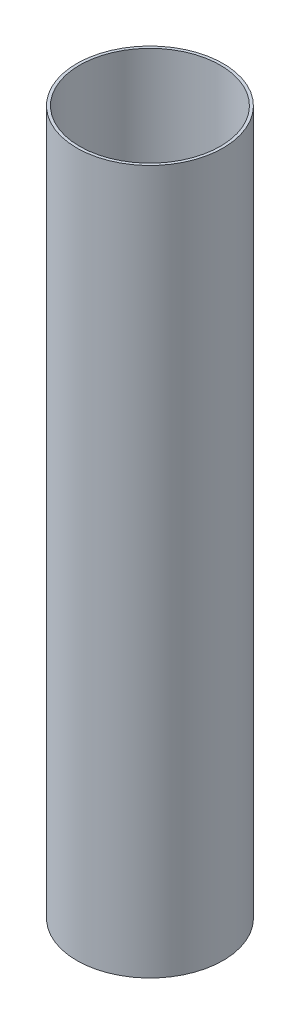
ISO-10303-21;
HEADER;
FILE_DESCRIPTION(('STEP AP214'),'2;1');
FILE_NAME('part.step','',(''),(''),'','','');
FILE_SCHEMA(('AUTOMOTIVE_DESIGN { 1 0 10303 214 1 1 1 1 }'));
ENDSEC;
DATA;
#1=APPLICATION_CONTEXT('core data for automotive mechanical design processes');
#2=APPLICATION_PROTOCOL_DEFINITION('international standard','automotive_design',2000,#1);
#3=PRODUCT_CONTEXT('',#1,'mechanical');
#4=PRODUCT('Part','Part','',(#3));
#5=PRODUCT_RELATED_PRODUCT_CATEGORY('part','',(#4));
#6=PRODUCT_DEFINITION_FORMATION('','',#4);
#7=PRODUCT_DEFINITION_CONTEXT('part definition',#1,'design');
#8=PRODUCT_DEFINITION('design','',#6,#7);
#9=PRODUCT_DEFINITION_SHAPE('','',#8);
#10=(LENGTH_UNIT() NAMED_UNIT(*) SI_UNIT(.MILLI.,.METRE.));
#11=(NAMED_UNIT(*) PLANE_ANGLE_UNIT() SI_UNIT($,.RADIAN.));
#12=(NAMED_UNIT(*) SI_UNIT($,.STERADIAN.) SOLID_ANGLE_UNIT());
#13=UNCERTAINTY_MEASURE_WITH_UNIT(LENGTH_MEASURE(1.E-05),#10,'distance_accuracy_value','');
#14=(GEOMETRIC_REPRESENTATION_CONTEXT(3) GLOBAL_UNCERTAINTY_ASSIGNED_CONTEXT((#13)) GLOBAL_UNIT_ASSIGNED_CONTEXT((#10,
#11,#12)) REPRESENTATION_CONTEXT('',''));
#15=CARTESIAN_POINT('',(0.,0.,0.));
#16=DIRECTION('',(0.,0.,1.));
#17=DIRECTION('',(1.,0.,0.));
#18=AXIS2_PLACEMENT_3D('',#15,#16,#17);
#19=CARTESIAN_POINT('',(0.,381.,0.));
#20=DIRECTION('',(0.,1.,0.));
#21=DIRECTION('',(0.,0.,1.));
#22=AXIS2_PLACEMENT_3D('',#19,#20,#21);
#23=PLANE('',#22);
#24=CARTESIAN_POINT('',(0.,381.,0.));
#25=DIRECTION('',(0.,1.,0.));
#26=DIRECTION('',(0.,0.,1.));
#27=AXIS2_PLACEMENT_3D('',#24,#25,#26);
#28=CIRCLE('',#27,39.624);
#29=CARTESIAN_POINT('',(0.,381.,39.624));
#30=VERTEX_POINT('',#29);
#31=EDGE_CURVE('E10',#30,#30,#28,.T.);
#32=ORIENTED_EDGE('',*,*,#31,.T.);
#33=EDGE_LOOP('',(#32));
#34=FACE_BOUND('',#33,.T.);
#35=CARTESIAN_POINT('',(0.,381.,0.));
#36=DIRECTION('',(0.,1.,0.));
#37=DIRECTION('',(0.,0.,1.));
#38=AXIS2_PLACEMENT_3D('',#35,#36,#37);
#39=CIRCLE('',#38,38.1);
#40=CARTESIAN_POINT('',(0.,381.,38.1));
#41=VERTEX_POINT('',#40);
#42=EDGE_CURVE('E56',#41,#41,#39,.T.);
#43=ORIENTED_EDGE('',*,*,#42,.F.);
#44=EDGE_LOOP('',(#43));
#45=FACE_BOUND('',#44,.T.);
#46=ADVANCED_FACE('F43',(#34,#45),#23,.T.);
#47=CARTESIAN_POINT('',(0.,0.,0.));
#48=DIRECTION('',(0.,1.,0.));
#49=DIRECTION('',(0.,0.,1.));
#50=AXIS2_PLACEMENT_3D('',#47,#48,#49);
#51=PLANE('',#50);
#52=CARTESIAN_POINT('',(0.,0.,0.));
#53=DIRECTION('',(0.,1.,0.));
#54=DIRECTION('',(0.,0.,1.));
#55=AXIS2_PLACEMENT_3D('',#52,#53,#54);
#56=CIRCLE('',#55,39.624);
#57=CARTESIAN_POINT('',(0.,0.,39.624));
#58=VERTEX_POINT('',#57);
#59=EDGE_CURVE('E47',#58,#58,#56,.T.);
#60=ORIENTED_EDGE('',*,*,#59,.F.);
#61=EDGE_LOOP('',(#60));
#62=FACE_BOUND('',#61,.T.);
#63=CARTESIAN_POINT('',(0.,0.,0.));
#64=DIRECTION('',(0.,1.,0.));
#65=DIRECTION('',(0.,0.,1.));
#66=AXIS2_PLACEMENT_3D('',#63,#64,#65);
#67=CIRCLE('',#66,38.1);
#68=CARTESIAN_POINT('',(0.,0.,38.1));
#69=VERTEX_POINT('',#68);
#70=EDGE_CURVE('E58',#69,#69,#67,.T.);
#71=ORIENTED_EDGE('',*,*,#70,.T.);
#72=EDGE_LOOP('',(#71));
#73=FACE_BOUND('',#72,.T.);
#74=ADVANCED_FACE('F70',(#62,#73),#51,.F.);
#75=CARTESIAN_POINT('',(0.,381.,0.));
#76=DIRECTION('',(0.,-1.,0.));
#77=DIRECTION('',(0.,0.,-1.));
#78=AXIS2_PLACEMENT_3D('',#75,#76,#77);
#79=CYLINDRICAL_SURFACE('',#78,39.624);
#80=ORIENTED_EDGE('',*,*,#31,.F.);
#81=EDGE_LOOP('',(#80));
#82=FACE_BOUND('',#81,.T.);
#83=ORIENTED_EDGE('',*,*,#59,.T.);
#84=EDGE_LOOP('',(#83));
#85=FACE_BOUND('',#84,.T.);
#86=ADVANCED_FACE('F45',(#82,#85),#79,.T.);
#87=CARTESIAN_POINT('',(0.,381.,0.));
#88=DIRECTION('',(0.,-1.,0.));
#89=DIRECTION('',(0.,0.,-1.));
#90=AXIS2_PLACEMENT_3D('',#87,#88,#89);
#91=CYLINDRICAL_SURFACE('',#90,38.1);
#92=ORIENTED_EDGE('',*,*,#42,.T.);
#93=EDGE_LOOP('',(#92));
#94=FACE_BOUND('',#93,.T.);
#95=ORIENTED_EDGE('',*,*,#70,.F.);
#96=EDGE_LOOP('',(#95));
#97=FACE_BOUND('',#96,.T.);
#98=ADVANCED_FACE('F66',(#94,#97),#91,.F.);
#99=CLOSED_SHELL('',(#46,#74,#86,#98));
#100=MANIFOLD_SOLID_BREP('B2',#99);
#101=ADVANCED_BREP_SHAPE_REPRESENTATION('',(#18,#100),#14);
#102=SHAPE_DEFINITION_REPRESENTATION(#9,#101);
ENDSEC;
END-ISO-10303-21;
